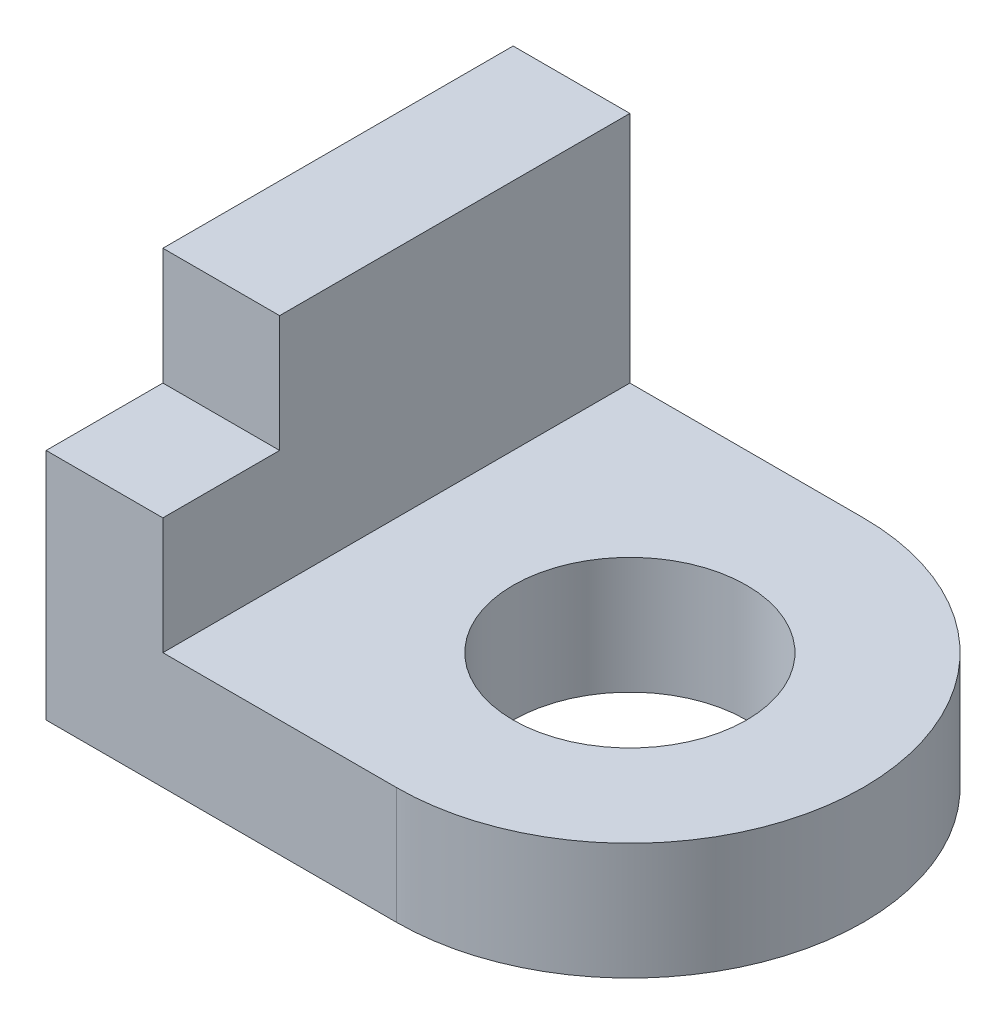
ISO-10303-21;
HEADER;
FILE_DESCRIPTION(('STEP AP214'),'2;1');
FILE_NAME('part.step','',(''),(''),'','','');
FILE_SCHEMA(('AUTOMOTIVE_DESIGN { 1 0 10303 214 1 1 1 1 }'));
ENDSEC;
DATA;
#1=APPLICATION_CONTEXT('core data for automotive mechanical design processes');
#2=APPLICATION_PROTOCOL_DEFINITION('international standard','automotive_design',2000,#1);
#3=PRODUCT_CONTEXT('',#1,'mechanical');
#4=PRODUCT('Part','Part','',(#3));
#5=PRODUCT_RELATED_PRODUCT_CATEGORY('part','',(#4));
#6=PRODUCT_DEFINITION_FORMATION('','',#4);
#7=PRODUCT_DEFINITION_CONTEXT('part definition',#1,'design');
#8=PRODUCT_DEFINITION('design','',#6,#7);
#9=PRODUCT_DEFINITION_SHAPE('','',#8);
#10=(LENGTH_UNIT() NAMED_UNIT(*) SI_UNIT(.MILLI.,.METRE.));
#11=(NAMED_UNIT(*) PLANE_ANGLE_UNIT() SI_UNIT($,.RADIAN.));
#12=(NAMED_UNIT(*) SI_UNIT($,.STERADIAN.) SOLID_ANGLE_UNIT());
#13=UNCERTAINTY_MEASURE_WITH_UNIT(LENGTH_MEASURE(1.E-05),#10,'distance_accuracy_value','');
#14=(GEOMETRIC_REPRESENTATION_CONTEXT(3) GLOBAL_UNCERTAINTY_ASSIGNED_CONTEXT((#13)) GLOBAL_UNIT_ASSIGNED_CONTEXT((#10,
#11,#12)) REPRESENTATION_CONTEXT('',''));
#15=CARTESIAN_POINT('',(0.,0.,0.));
#16=DIRECTION('',(0.,0.,1.));
#17=DIRECTION('',(1.,0.,0.));
#18=AXIS2_PLACEMENT_3D('',#15,#16,#17);
#19=CARTESIAN_POINT('',(0.,30.,-40.));
#20=DIRECTION('',(0.,0.,-1.));
#21=DIRECTION('',(-1.,0.,0.));
#22=AXIS2_PLACEMENT_3D('',#19,#20,#21);
#23=PLANE('',#22);
#24=DIRECTION('',(1.,0.,0.));
#25=VECTOR('',#24,1.);
#26=CARTESIAN_POINT('',(0.,0.,-40.));
#27=LINE('',#26,#25);
#28=CARTESIAN_POINT('',(0.,0.,-40.));
#29=VERTEX_POINT('',#28);
#30=CARTESIAN_POINT('',(30.,0.,-40.));
#31=VERTEX_POINT('',#30);
#32=EDGE_CURVE('E193',#29,#31,#27,.T.);
#33=ORIENTED_EDGE('',*,*,#32,.F.);
#34=DIRECTION('',(0.,-1.,0.));
#35=VECTOR('',#34,1.);
#36=CARTESIAN_POINT('',(0.,30.,-40.));
#37=LINE('',#36,#35);
#38=CARTESIAN_POINT('',(0.,30.,-40.));
#39=VERTEX_POINT('',#38);
#40=EDGE_CURVE('E11',#39,#29,#37,.T.);
#41=ORIENTED_EDGE('',*,*,#40,.F.);
#42=DIRECTION('',(1.,0.,0.));
#43=VECTOR('',#42,1.);
#44=CARTESIAN_POINT('',(0.,30.,-40.));
#45=LINE('',#44,#43);
#46=CARTESIAN_POINT('',(10.,30.,-40.));
#47=VERTEX_POINT('',#46);
#48=EDGE_CURVE('E201',#39,#47,#45,.T.);
#49=ORIENTED_EDGE('',*,*,#48,.T.);
#50=DIRECTION('',(0.,-1.,0.));
#51=VECTOR('',#50,1.);
#52=CARTESIAN_POINT('',(10.,30.,-40.));
#53=LINE('',#52,#51);
#54=CARTESIAN_POINT('',(10.,10.,-40.));
#55=VERTEX_POINT('',#54);
#56=EDGE_CURVE('E128',#47,#55,#53,.T.);
#57=ORIENTED_EDGE('',*,*,#56,.T.);
#58=DIRECTION('',(1.,0.,0.));
#59=VECTOR('',#58,1.);
#60=CARTESIAN_POINT('',(0.,10.,-40.));
#61=LINE('',#60,#59);
#62=CARTESIAN_POINT('',(30.,10.,-40.));
#63=VERTEX_POINT('',#62);
#64=EDGE_CURVE('E122',#55,#63,#61,.T.);
#65=ORIENTED_EDGE('',*,*,#64,.T.);
#66=DIRECTION('',(0.,-1.,0.));
#67=VECTOR('',#66,1.);
#68=CARTESIAN_POINT('',(30.,10.,-40.));
#69=LINE('',#68,#67);
#70=EDGE_CURVE('E105',#63,#31,#69,.T.);
#71=ORIENTED_EDGE('',*,*,#70,.T.);
#72=EDGE_LOOP('',(#33,#41,#49,#57,#65,#71));
#73=FACE_BOUND('',#72,.T.);
#74=ADVANCED_FACE('F39',(#73),#23,.T.);
#75=CARTESIAN_POINT('',(0.,30.,0.));
#76=DIRECTION('',(1.,0.,0.));
#77=DIRECTION('',(0.,0.,-1.));
#78=AXIS2_PLACEMENT_3D('',#75,#76,#77);
#79=PLANE('',#78);
#80=DIRECTION('',(0.,0.,1.));
#81=VECTOR('',#80,1.);
#82=CARTESIAN_POINT('',(0.,0.,0.));
#83=LINE('',#82,#81);
#84=CARTESIAN_POINT('',(0.,0.,0.));
#85=VERTEX_POINT('',#84);
#86=EDGE_CURVE('E169',#29,#85,#83,.T.);
#87=ORIENTED_EDGE('',*,*,#86,.T.);
#88=DIRECTION('',(0.,-1.,0.));
#89=VECTOR('',#88,1.);
#90=CARTESIAN_POINT('',(0.,20.,0.));
#91=LINE('',#90,#89);
#92=CARTESIAN_POINT('',(0.,20.,0.));
#93=VERTEX_POINT('',#92);
#94=EDGE_CURVE('E188',#93,#85,#91,.T.);
#95=ORIENTED_EDGE('',*,*,#94,.F.);
#96=DIRECTION('',(0.,0.,1.));
#97=VECTOR('',#96,1.);
#98=CARTESIAN_POINT('',(0.,20.,0.));
#99=LINE('',#98,#97);
#100=CARTESIAN_POINT('',(0.,20.,-10.));
#101=VERTEX_POINT('',#100);
#102=EDGE_CURVE('E153',#101,#93,#99,.T.);
#103=ORIENTED_EDGE('',*,*,#102,.F.);
#104=DIRECTION('',(0.,-1.,0.));
#105=VECTOR('',#104,1.);
#106=CARTESIAN_POINT('',(0.,30.,-10.));
#107=LINE('',#106,#105);
#108=CARTESIAN_POINT('',(0.,30.,-10.));
#109=VERTEX_POINT('',#108);
#110=EDGE_CURVE('E47',#109,#101,#107,.T.);
#111=ORIENTED_EDGE('',*,*,#110,.F.);
#112=DIRECTION('',(0.,0.,1.));
#113=VECTOR('',#112,1.);
#114=CARTESIAN_POINT('',(0.,30.,0.));
#115=LINE('',#114,#113);
#116=EDGE_CURVE('E205',#39,#109,#115,.T.);
#117=ORIENTED_EDGE('',*,*,#116,.F.);
#118=ORIENTED_EDGE('',*,*,#40,.T.);
#119=EDGE_LOOP('',(#87,#95,#103,#111,#117,#118));
#120=FACE_BOUND('',#119,.T.);
#121=ADVANCED_FACE('F186',(#120),#79,.F.);
#122=CARTESIAN_POINT('',(0.,30.,-10.));
#123=DIRECTION('',(0.,0.,1.));
#124=DIRECTION('',(1.,0.,0.));
#125=AXIS2_PLACEMENT_3D('',#122,#123,#124);
#126=PLANE('',#125);
#127=DIRECTION('',(-1.,0.,0.));
#128=VECTOR('',#127,1.);
#129=CARTESIAN_POINT('',(0.,20.,-10.));
#130=LINE('',#129,#128);
#131=CARTESIAN_POINT('',(10.,20.,-10.));
#132=VERTEX_POINT('',#131);
#133=EDGE_CURVE('E63',#132,#101,#130,.T.);
#134=ORIENTED_EDGE('',*,*,#133,.F.);
#135=DIRECTION('',(0.,-1.,0.));
#136=VECTOR('',#135,1.);
#137=CARTESIAN_POINT('',(10.,30.,-10.));
#138=LINE('',#137,#136);
#139=CARTESIAN_POINT('',(10.,30.,-10.));
#140=VERTEX_POINT('',#139);
#141=EDGE_CURVE('E164',#140,#132,#138,.T.);
#142=ORIENTED_EDGE('',*,*,#141,.F.);
#143=DIRECTION('',(-1.,0.,0.));
#144=VECTOR('',#143,1.);
#145=CARTESIAN_POINT('',(0.,30.,-10.));
#146=LINE('',#145,#144);
#147=EDGE_CURVE('E179',#140,#109,#146,.T.);
#148=ORIENTED_EDGE('',*,*,#147,.T.);
#149=ORIENTED_EDGE('',*,*,#110,.T.);
#150=EDGE_LOOP('',(#134,#142,#148,#149));
#151=FACE_BOUND('',#150,.T.);
#152=ADVANCED_FACE('F177',(#151),#126,.T.);
#153=CARTESIAN_POINT('',(10.,30.,0.));
#154=DIRECTION('',(1.,0.,0.));
#155=DIRECTION('',(0.,0.,-1.));
#156=AXIS2_PLACEMENT_3D('',#153,#154,#155);
#157=PLANE('',#156);
#158=DIRECTION('',(0.,0.,1.));
#159=VECTOR('',#158,1.);
#160=CARTESIAN_POINT('',(10.,10.,0.));
#161=LINE('',#160,#159);
#162=CARTESIAN_POINT('',(10.,10.,0.));
#163=VERTEX_POINT('',#162);
#164=EDGE_CURVE('E55',#55,#163,#161,.T.);
#165=ORIENTED_EDGE('',*,*,#164,.F.);
#166=ORIENTED_EDGE('',*,*,#56,.F.);
#167=DIRECTION('',(0.,0.,1.));
#168=VECTOR('',#167,1.);
#169=CARTESIAN_POINT('',(10.,30.,0.));
#170=LINE('',#169,#168);
#171=EDGE_CURVE('E165',#47,#140,#170,.T.);
#172=ORIENTED_EDGE('',*,*,#171,.T.);
#173=ORIENTED_EDGE('',*,*,#141,.T.);
#174=DIRECTION('',(0.,0.,1.));
#175=VECTOR('',#174,1.);
#176=CARTESIAN_POINT('',(10.,20.,0.));
#177=LINE('',#176,#175);
#178=CARTESIAN_POINT('',(10.,20.,0.));
#179=VERTEX_POINT('',#178);
#180=EDGE_CURVE('E154',#132,#179,#177,.T.);
#181=ORIENTED_EDGE('',*,*,#180,.T.);
#182=DIRECTION('',(0.,-1.,0.));
#183=VECTOR('',#182,1.);
#184=CARTESIAN_POINT('',(10.,20.,0.));
#185=LINE('',#184,#183);
#186=EDGE_CURVE('E135',#179,#163,#185,.T.);
#187=ORIENTED_EDGE('',*,*,#186,.T.);
#188=EDGE_LOOP('',(#165,#166,#172,#173,#181,#187));
#189=FACE_BOUND('',#188,.T.);
#190=ADVANCED_FACE('F197',(#189),#157,.T.);
#191=CARTESIAN_POINT('',(0.,30.,0.));
#192=DIRECTION('',(0.,1.,0.));
#193=DIRECTION('',(0.,0.,1.));
#194=AXIS2_PLACEMENT_3D('',#191,#192,#193);
#195=PLANE('',#194);
#196=ORIENTED_EDGE('',*,*,#48,.F.);
#197=ORIENTED_EDGE('',*,*,#116,.T.);
#198=ORIENTED_EDGE('',*,*,#147,.F.);
#199=ORIENTED_EDGE('',*,*,#171,.F.);
#200=EDGE_LOOP('',(#196,#197,#198,#199));
#201=FACE_BOUND('',#200,.T.);
#202=ADVANCED_FACE('F211',(#201),#195,.T.);
#203=CARTESIAN_POINT('',(0.,0.,0.));
#204=DIRECTION('',(0.,1.,0.));
#205=DIRECTION('',(0.,0.,1.));
#206=AXIS2_PLACEMENT_3D('',#203,#204,#205);
#207=PLANE('',#206);
#208=ORIENTED_EDGE('',*,*,#32,.T.);
#209=CARTESIAN_POINT('',(30.,0.,-20.));
#210=DIRECTION('',(0.,1.,0.));
#211=DIRECTION('',(0.,0.,1.));
#212=AXIS2_PLACEMENT_3D('',#209,#210,#211);
#213=CIRCLE('',#212,20.);
#214=CARTESIAN_POINT('',(30.,0.,0.));
#215=VERTEX_POINT('',#214);
#216=EDGE_CURVE('E112',#31,#215,#213,.F.);
#217=ORIENTED_EDGE('',*,*,#216,.T.);
#218=DIRECTION('',(1.,0.,0.));
#219=VECTOR('',#218,1.);
#220=CARTESIAN_POINT('',(0.,0.,0.));
#221=LINE('',#220,#219);
#222=EDGE_CURVE('E116',#85,#215,#221,.T.);
#223=ORIENTED_EDGE('',*,*,#222,.F.);
#224=ORIENTED_EDGE('',*,*,#86,.F.);
#225=EDGE_LOOP('',(#208,#217,#223,#224));
#226=FACE_BOUND('',#225,.T.);
#227=CARTESIAN_POINT('',(30.,0.,-20.));
#228=DIRECTION('',(0.,1.,0.));
#229=DIRECTION('',(0.,0.,1.));
#230=AXIS2_PLACEMENT_3D('',#227,#228,#229);
#231=CIRCLE('',#230,10.);
#232=CARTESIAN_POINT('',(30.,0.,-9.99999999999999));
#233=VERTEX_POINT('',#232);
#234=EDGE_CURVE('E141',#233,#233,#231,.T.);
#235=ORIENTED_EDGE('',*,*,#234,.T.);
#236=EDGE_LOOP('',(#235));
#237=FACE_BOUND('',#236,.T.);
#238=ADVANCED_FACE('F199',(#226,#237),#207,.F.);
#239=CARTESIAN_POINT('',(0.,20.,0.));
#240=DIRECTION('',(0.,0.,-1.));
#241=DIRECTION('',(-1.,0.,0.));
#242=AXIS2_PLACEMENT_3D('',#239,#240,#241);
#243=PLANE('',#242);
#244=ORIENTED_EDGE('',*,*,#222,.T.);
#245=DIRECTION('',(0.,-1.,0.));
#246=VECTOR('',#245,1.);
#247=CARTESIAN_POINT('',(30.,10.,0.));
#248=LINE('',#247,#246);
#249=CARTESIAN_POINT('',(30.,10.,0.));
#250=VERTEX_POINT('',#249);
#251=EDGE_CURVE('E117',#250,#215,#248,.T.);
#252=ORIENTED_EDGE('',*,*,#251,.F.);
#253=DIRECTION('',(-1.,0.,0.));
#254=VECTOR('',#253,1.);
#255=CARTESIAN_POINT('',(0.,10.,0.));
#256=LINE('',#255,#254);
#257=EDGE_CURVE('E124',#250,#163,#256,.T.);
#258=ORIENTED_EDGE('',*,*,#257,.T.);
#259=ORIENTED_EDGE('',*,*,#186,.F.);
#260=DIRECTION('',(1.,0.,0.));
#261=VECTOR('',#260,1.);
#262=CARTESIAN_POINT('',(0.,20.,0.));
#263=LINE('',#262,#261);
#264=EDGE_CURVE('E148',#93,#179,#263,.T.);
#265=ORIENTED_EDGE('',*,*,#264,.F.);
#266=ORIENTED_EDGE('',*,*,#94,.T.);
#267=EDGE_LOOP('',(#244,#252,#258,#259,#265,#266));
#268=FACE_BOUND('',#267,.T.);
#269=ADVANCED_FACE('F196',(#268),#243,.F.);
#270=CARTESIAN_POINT('',(0.,20.,0.));
#271=DIRECTION('',(0.,1.,0.));
#272=DIRECTION('',(0.,0.,1.));
#273=AXIS2_PLACEMENT_3D('',#270,#271,#272);
#274=PLANE('',#273);
#275=ORIENTED_EDGE('',*,*,#180,.F.);
#276=ORIENTED_EDGE('',*,*,#133,.T.);
#277=ORIENTED_EDGE('',*,*,#102,.T.);
#278=ORIENTED_EDGE('',*,*,#264,.T.);
#279=EDGE_LOOP('',(#275,#276,#277,#278));
#280=FACE_BOUND('',#279,.T.);
#281=ADVANCED_FACE('F184',(#280),#274,.T.);
#282=CARTESIAN_POINT('',(30.,10.,-20.));
#283=DIRECTION('',(0.,-1.,0.));
#284=DIRECTION('',(0.,0.,-1.));
#285=AXIS2_PLACEMENT_3D('',#282,#283,#284);
#286=CYLINDRICAL_SURFACE('',#285,20.);
#287=ORIENTED_EDGE('',*,*,#216,.F.);
#288=ORIENTED_EDGE('',*,*,#70,.F.);
#289=CARTESIAN_POINT('',(30.,10.,-20.));
#290=DIRECTION('',(0.,1.,0.));
#291=DIRECTION('',(0.,0.,1.));
#292=AXIS2_PLACEMENT_3D('',#289,#290,#291);
#293=CIRCLE('',#292,20.);
#294=EDGE_CURVE('E109',#63,#250,#293,.F.);
#295=ORIENTED_EDGE('',*,*,#294,.T.);
#296=ORIENTED_EDGE('',*,*,#251,.T.);
#297=EDGE_LOOP('',(#287,#288,#295,#296));
#298=FACE_BOUND('',#297,.T.);
#299=ADVANCED_FACE('F107',(#298),#286,.T.);
#300=CARTESIAN_POINT('',(30.,10.,-20.));
#301=DIRECTION('',(0.,-1.,0.));
#302=DIRECTION('',(0.,0.,-1.));
#303=AXIS2_PLACEMENT_3D('',#300,#301,#302);
#304=CYLINDRICAL_SURFACE('',#303,10.);
#305=CARTESIAN_POINT('',(30.,10.,-20.));
#306=DIRECTION('',(0.,1.,0.));
#307=DIRECTION('',(0.,0.,1.));
#308=AXIS2_PLACEMENT_3D('',#305,#306,#307);
#309=CIRCLE('',#308,10.);
#310=CARTESIAN_POINT('',(30.,10.,-9.99999999999999));
#311=VERTEX_POINT('',#310);
#312=EDGE_CURVE('E125',#311,#311,#309,.T.);
#313=ORIENTED_EDGE('',*,*,#312,.T.);
#314=EDGE_LOOP('',(#313));
#315=FACE_BOUND('',#314,.T.);
#316=ORIENTED_EDGE('',*,*,#234,.F.);
#317=EDGE_LOOP('',(#316));
#318=FACE_BOUND('',#317,.T.);
#319=ADVANCED_FACE('F265',(#315,#318),#304,.F.);
#320=CARTESIAN_POINT('',(0.,10.,0.));
#321=DIRECTION('',(0.,1.,0.));
#322=DIRECTION('',(0.,0.,1.));
#323=AXIS2_PLACEMENT_3D('',#320,#321,#322);
#324=PLANE('',#323);
#325=ORIENTED_EDGE('',*,*,#312,.F.);
#326=EDGE_LOOP('',(#325));
#327=FACE_BOUND('',#326,.T.);
#328=ORIENTED_EDGE('',*,*,#294,.F.);
#329=ORIENTED_EDGE('',*,*,#64,.F.);
#330=ORIENTED_EDGE('',*,*,#164,.T.);
#331=ORIENTED_EDGE('',*,*,#257,.F.);
#332=EDGE_LOOP('',(#328,#329,#330,#331));
#333=FACE_BOUND('',#332,.T.);
#334=ADVANCED_FACE('F121',(#327,#333),#324,.T.);
#335=CLOSED_SHELL('',(#74,#121,#152,#190,#202,#238,#269,#281,#299,#319,#334));
#336=MANIFOLD_SOLID_BREP('B2',#335);
#337=ADVANCED_BREP_SHAPE_REPRESENTATION('',(#18,#336),#14);
#338=SHAPE_DEFINITION_REPRESENTATION(#9,#337);
ENDSEC;
END-ISO-10303-21;
